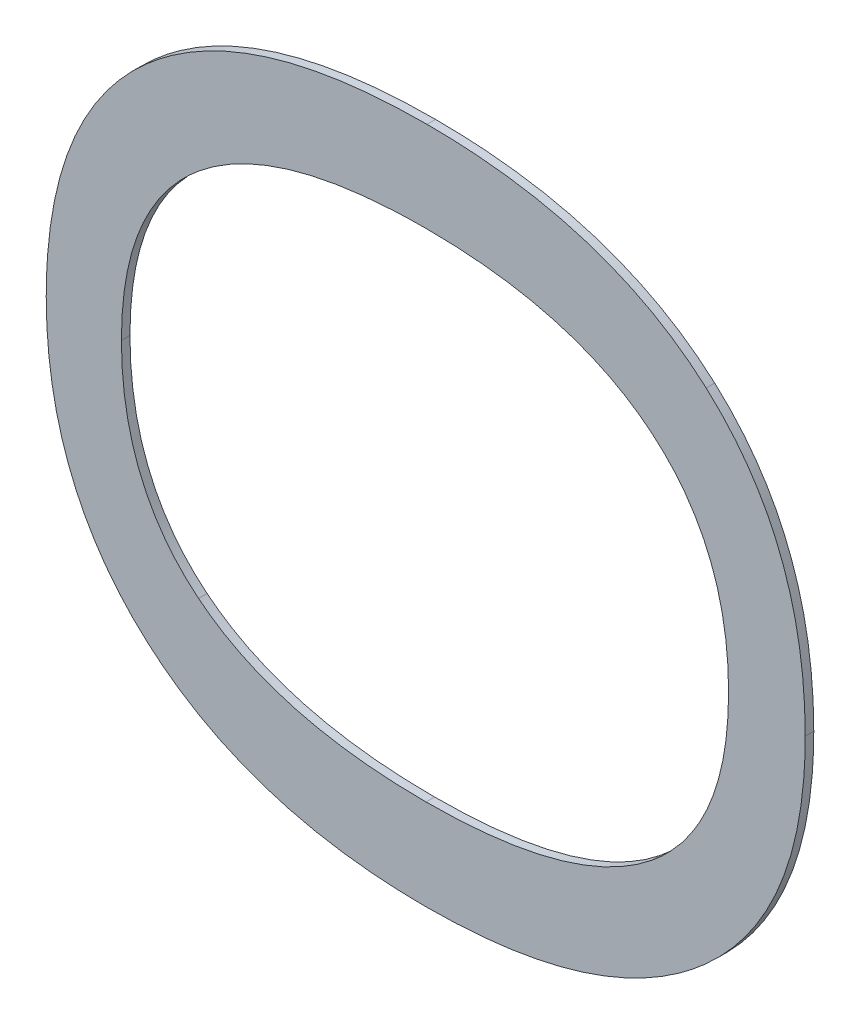
ISO-10303-21;
HEADER;
FILE_DESCRIPTION(('STEP AP214'),'2;1');
FILE_NAME('part.step','',(''),(''),'','','');
FILE_SCHEMA(('AUTOMOTIVE_DESIGN { 1 0 10303 214 1 1 1 1 }'));
ENDSEC;
DATA;
#1=APPLICATION_CONTEXT('core data for automotive mechanical design processes');
#2=APPLICATION_PROTOCOL_DEFINITION('international standard','automotive_design',2000,#1);
#3=PRODUCT_CONTEXT('',#1,'mechanical');
#4=PRODUCT('Part','Part','',(#3));
#5=PRODUCT_RELATED_PRODUCT_CATEGORY('part','',(#4));
#6=PRODUCT_DEFINITION_FORMATION('','',#4);
#7=PRODUCT_DEFINITION_CONTEXT('part definition',#1,'design');
#8=PRODUCT_DEFINITION('design','',#6,#7);
#9=PRODUCT_DEFINITION_SHAPE('','',#8);
#10=(LENGTH_UNIT() NAMED_UNIT(*) SI_UNIT(.MILLI.,.METRE.));
#11=(NAMED_UNIT(*) PLANE_ANGLE_UNIT() SI_UNIT($,.RADIAN.));
#12=(NAMED_UNIT(*) SI_UNIT($,.STERADIAN.) SOLID_ANGLE_UNIT());
#13=UNCERTAINTY_MEASURE_WITH_UNIT(LENGTH_MEASURE(1.E-05),#10,'distance_accuracy_value','');
#14=(GEOMETRIC_REPRESENTATION_CONTEXT(3) GLOBAL_UNCERTAINTY_ASSIGNED_CONTEXT((#13)) GLOBAL_UNIT_ASSIGNED_CONTEXT((#10,
#11,#12)) REPRESENTATION_CONTEXT('',''));
#15=CARTESIAN_POINT('',(0.,0.,0.));
#16=DIRECTION('',(0.,0.,1.));
#17=DIRECTION('',(1.,0.,0.));
#18=AXIS2_PLACEMENT_3D('',#15,#16,#17);
#19=CARTESIAN_POINT('',(32.574920494297,13.734089114766,2.64));
#20=DIRECTION('',(0.,0.,1.));
#21=DIRECTION('',(1.,0.,0.));
#22=AXIS2_PLACEMENT_3D('',#19,#20,#21);
#23=PLANE('',#22);
#24=CARTESIAN_POINT('',(32.471042254931,15.863117720616,2.64));
#25=CARTESIAN_POINT('',(32.471042254931,16.005350196577,2.64));
#26=CARTESIAN_POINT('',(32.561708375066,16.080055301813,2.64));
#27=B_SPLINE_CURVE_WITH_KNOTS('',2,(#24,#25,#26),.UNSPECIFIED.,.F.,.F.,(3,3),(0.,1.),.UNSPECIFIED.);
#28=CARTESIAN_POINT('',(32.561708375066,16.080055301813,2.64));
#29=VERTEX_POINT('',#28);
#30=CARTESIAN_POINT('',(32.471042254931,15.863117720616,2.64));
#31=VERTEX_POINT('',#30);
#32=EDGE_CURVE('E290',#29,#31,#27,.F.);
#33=ORIENTED_EDGE('',*,*,#32,.T.);
#34=CARTESIAN_POINT('',(32.561330599565,15.646557914919,2.64));
#35=CARTESIAN_POINT('',(32.471042254931,15.719751918153,2.64));
#36=CARTESIAN_POINT('',(32.471042254931,15.863117720616,2.64));
#37=B_SPLINE_CURVE_WITH_KNOTS('',2,(#34,#35,#36),.UNSPECIFIED.,.F.,.F.,(3,3),(0.,1.),.UNSPECIFIED.);
#38=CARTESIAN_POINT('',(32.561330599565,15.646557914919,2.64));
#39=VERTEX_POINT('',#38);
#40=EDGE_CURVE('E282',#31,#39,#37,.F.);
#41=ORIENTED_EDGE('',*,*,#40,.T.);
#42=CARTESIAN_POINT('',(32.827662327461,15.573363911686,2.64));
#43=CARTESIAN_POINT('',(32.651618944199,15.573363911686,2.64));
#44=CARTESIAN_POINT('',(32.561330599565,15.646557914919,2.64));
#45=B_SPLINE_CURVE_WITH_KNOTS('',2,(#42,#43,#44),.UNSPECIFIED.,.F.,.F.,(3,3),(0.,1.),.UNSPECIFIED.);
#46=CARTESIAN_POINT('',(32.827662327461,15.573363911686,2.64));
#47=VERTEX_POINT('',#46);
#48=EDGE_CURVE('E273',#39,#47,#45,.F.);
#49=ORIENTED_EDGE('',*,*,#48,.T.);
#50=CARTESIAN_POINT('',(33.091821846228,15.646274583294,2.64));
#51=CARTESIAN_POINT('',(33.001816833219,15.573363911686,2.64));
#52=CARTESIAN_POINT('',(32.827662327461,15.573363911686,2.64));
#53=B_SPLINE_CURVE_WITH_KNOTS('',2,(#50,#51,#52),.UNSPECIFIED.,.F.,.F.,(3,3),(0.,1.),.UNSPECIFIED.);
#54=CARTESIAN_POINT('',(33.091821846228,15.646274583294,2.64));
#55=VERTEX_POINT('',#54);
#56=EDGE_CURVE('E264',#47,#55,#53,.F.);
#57=ORIENTED_EDGE('',*,*,#56,.T.);
#58=CARTESIAN_POINT('',(33.181826859236,15.861984394114,2.64));
#59=CARTESIAN_POINT('',(33.181826859236,15.719185254902,2.64));
#60=CARTESIAN_POINT('',(33.091821846228,15.646274583294,2.64));
#61=B_SPLINE_CURVE_WITH_KNOTS('',2,(#58,#59,#60),.UNSPECIFIED.,.F.,.F.,(3,3),(0.,1.),.UNSPECIFIED.);
#62=CARTESIAN_POINT('',(33.181826859236,15.861984394114,2.64));
#63=VERTEX_POINT('',#62);
#64=EDGE_CURVE('E255',#55,#63,#61,.F.);
#65=ORIENTED_EDGE('',*,*,#64,.T.);
#66=CARTESIAN_POINT('',(33.091160739102,16.080055301813,2.64));
#67=CARTESIAN_POINT('',(33.181826859236,16.005350196577,2.64));
#68=CARTESIAN_POINT('',(33.181826859236,15.861984394114,2.64));
#69=B_SPLINE_CURVE_WITH_KNOTS('',2,(#66,#67,#68),.UNSPECIFIED.,.F.,.F.,(3,3),(0.,1.),.UNSPECIFIED.);
#70=CARTESIAN_POINT('',(33.091160739102,16.080055301813,2.64));
#71=VERTEX_POINT('',#70);
#72=EDGE_CURVE('E246',#63,#71,#69,.F.);
#73=ORIENTED_EDGE('',*,*,#72,.T.);
#74=CARTESIAN_POINT('',(32.827662327461,16.154760407049,2.64));
#75=CARTESIAN_POINT('',(33.000494618967,16.154760407049,2.64));
#76=CARTESIAN_POINT('',(33.091160739102,16.080055301813,2.64));
#77=B_SPLINE_CURVE_WITH_KNOTS('',2,(#74,#75,#76),.UNSPECIFIED.,.F.,.F.,(3,3),(0.,1.),.UNSPECIFIED.);
#78=CARTESIAN_POINT('',(32.827662327461,16.154760407049,2.64));
#79=VERTEX_POINT('',#78);
#80=EDGE_CURVE('E237',#71,#79,#77,.F.);
#81=ORIENTED_EDGE('',*,*,#80,.T.);
#82=CARTESIAN_POINT('',(32.561708375066,16.080055301813,2.64));
#83=CARTESIAN_POINT('',(32.6523744952,16.154760407049,2.64));
#84=CARTESIAN_POINT('',(32.827662327461,16.154760407049,2.64));
#85=B_SPLINE_CURVE_WITH_KNOTS('',2,(#82,#83,#84),.UNSPECIFIED.,.F.,.F.,(3,3),(0.,1.),.UNSPECIFIED.);
#86=EDGE_CURVE('E21',#79,#29,#85,.F.);
#87=ORIENTED_EDGE('',*,*,#86,.T.);
#88=EDGE_LOOP('',(#33,#41,#49,#57,#65,#73,#81,#87));
#89=FACE_BOUND('',#88,.T.);
#90=CARTESIAN_POINT('',(32.3830205633,15.863117720616,2.64));
#91=CARTESIAN_POINT('',(32.3830205633,15.676685511089,2.64));
#92=CARTESIAN_POINT('',(32.501736514352,15.571852809683,2.64));
#93=B_SPLINE_CURVE_WITH_KNOTS('',2,(#90,#91,#92),.UNSPECIFIED.,.F.,.F.,(3,3),(0.,1.),.UNSPECIFIED.);
#94=CARTESIAN_POINT('',(32.501736514352,15.571852809683,2.64));
#95=VERTEX_POINT('',#94);
#96=CARTESIAN_POINT('',(32.3830205633,15.863117720616,2.64));
#97=VERTEX_POINT('',#96);
#98=EDGE_CURVE('E222',#95,#97,#93,.F.);
#99=ORIENTED_EDGE('',*,*,#98,.T.);
#100=CARTESIAN_POINT('',(32.499658749099,16.157310391678,2.64));
#101=CARTESIAN_POINT('',(32.3830205633,16.053705460649,2.64));
#102=CARTESIAN_POINT('',(32.3830205633,15.863117720616,2.64));
#103=B_SPLINE_CURVE_WITH_KNOTS('',2,(#100,#101,#102),.UNSPECIFIED.,.F.,.F.,(3,3),(0.,1.),.UNSPECIFIED.);
#104=CARTESIAN_POINT('',(32.499658749099,16.157310391678,2.64));
#105=VERTEX_POINT('',#104);
#106=EDGE_CURVE('E213',#97,#105,#103,.F.);
#107=ORIENTED_EDGE('',*,*,#106,.T.);
#108=CARTESIAN_POINT('',(32.828795653962,16.260915322706,2.64));
#109=CARTESIAN_POINT('',(32.616296934897,16.260915322706,2.64));
#110=CARTESIAN_POINT('',(32.499658749099,16.157310391678,2.64));
#111=B_SPLINE_CURVE_WITH_KNOTS('',2,(#108,#109,#110),.UNSPECIFIED.,.F.,.F.,(3,3),(0.,1.),.UNSPECIFIED.);
#112=CARTESIAN_POINT('',(32.828795653962,16.260915322706,2.64));
#113=VERTEX_POINT('',#112);
#114=EDGE_CURVE('E204',#105,#113,#111,.F.);
#115=ORIENTED_EDGE('',*,*,#114,.T.);
#116=CARTESIAN_POINT('',(33.155571461947,16.157027060052,2.64));
#117=CARTESIAN_POINT('',(33.039594383275,16.260915322706,2.64));
#118=CARTESIAN_POINT('',(32.828795653962,16.260915322706,2.64));
#119=B_SPLINE_CURVE_WITH_KNOTS('',2,(#116,#117,#118),.UNSPECIFIED.,.F.,.F.,(3,3),(0.,1.),.UNSPECIFIED.);
#120=CARTESIAN_POINT('',(33.155571461947,16.157027060052,2.64));
#121=VERTEX_POINT('',#120);
#122=EDGE_CURVE('E192',#113,#121,#119,.F.);
#123=ORIENTED_EDGE('',*,*,#122,.T.);
#124=CARTESIAN_POINT('',(33.27154854062,15.861984394114,2.64));
#125=CARTESIAN_POINT('',(33.27154854062,16.053138797398,2.64));
#126=CARTESIAN_POINT('',(33.155571461947,16.157027060052,2.64));
#127=B_SPLINE_CURVE_WITH_KNOTS('',2,(#124,#125,#126),.UNSPECIFIED.,.F.,.F.,(3,3),(0.,1.),.UNSPECIFIED.);
#128=CARTESIAN_POINT('',(33.27154854062,15.861984394114,2.64));
#129=VERTEX_POINT('',#128);
#130=EDGE_CURVE('E188',#121,#129,#127,.F.);
#131=ORIENTED_EDGE('',*,*,#130,.T.);
#132=CARTESIAN_POINT('',(33.153493696694,15.571475034183,2.64));
#133=CARTESIAN_POINT('',(33.27154854062,15.675929960088,2.64));
#134=CARTESIAN_POINT('',(33.27154854062,15.861984394114,2.64));
#135=B_SPLINE_CURVE_WITH_KNOTS('',2,(#132,#133,#134),.UNSPECIFIED.,.F.,.F.,(3,3),(0.,1.),.UNSPECIFIED.);
#136=CARTESIAN_POINT('',(33.153493696694,15.571475034183,2.64));
#137=VERTEX_POINT('',#136);
#138=EDGE_CURVE('E135',#129,#137,#135,.F.);
#139=ORIENTED_EDGE('',*,*,#138,.T.);
#140=CARTESIAN_POINT('',(32.827662327461,15.467020108278,2.64));
#141=CARTESIAN_POINT('',(33.035438852769,15.467020108278,2.64));
#142=CARTESIAN_POINT('',(33.153493696694,15.571475034183,2.64));
#143=B_SPLINE_CURVE_WITH_KNOTS('',2,(#140,#141,#142),.UNSPECIFIED.,.F.,.F.,(3,3),(0.,1.),.UNSPECIFIED.);
#144=CARTESIAN_POINT('',(32.827662327461,15.467020108278,2.64));
#145=VERTEX_POINT('',#144);
#146=EDGE_CURVE('E130',#137,#145,#143,.F.);
#147=ORIENTED_EDGE('',*,*,#146,.T.);
#148=CARTESIAN_POINT('',(32.501736514352,15.571852809683,2.64));
#149=CARTESIAN_POINT('',(32.620452465403,15.467020108278,2.64));
#150=CARTESIAN_POINT('',(32.827662327461,15.467020108278,2.64));
#151=B_SPLINE_CURVE_WITH_KNOTS('',2,(#148,#149,#150),.UNSPECIFIED.,.F.,.F.,(3,3),(0.,1.),.UNSPECIFIED.);
#152=EDGE_CURVE('E132',#145,#95,#151,.F.);
#153=ORIENTED_EDGE('',*,*,#152,.T.);
#154=EDGE_LOOP('',(#99,#107,#115,#123,#131,#139,#147,#153));
#155=FACE_BOUND('',#154,.T.);
#156=ADVANCED_FACE('F17',(#89,#155),#23,.F.);
#157=CARTESIAN_POINT('',(32.827662327461,15.467020108278,2.64));
#158=CARTESIAN_POINT('',(32.620452465403,15.467020108278,2.64));
#159=CARTESIAN_POINT('',(32.501736514352,15.571852809683,2.64));
#160=(BOUNDED_CURVE() B_SPLINE_CURVE(2,(#157,#158,#159),.UNSPECIFIED.,.F.,
.F.) B_SPLINE_CURVE_WITH_KNOTS((3,3),(0.,1.),
.UNSPECIFIED.) CURVE() GEOMETRIC_REPRESENTATION_ITEM() RATIONAL_B_SPLINE_CURVE((1.,1.,1.)) REPRESENTATION_ITEM(''));
#161=DIRECTION('',(0.,0.,1.));
#162=VECTOR('',#161,1.);
#163=SURFACE_OF_LINEAR_EXTRUSION('',#160,#162);
#164=DIRECTION('',(0.,0.,1.));
#165=VECTOR('',#164,1.);
#166=CARTESIAN_POINT('',(32.501736514352,15.571852809683,2.64));
#167=LINE('',#166,#165);
#168=CARTESIAN_POINT('',(32.501736514352,15.571852809683,2.65));
#169=VERTEX_POINT('',#168);
#170=EDGE_CURVE('E145',#169,#95,#167,.F.);
#171=ORIENTED_EDGE('',*,*,#170,.T.);
#172=ORIENTED_EDGE('',*,*,#152,.F.);
#173=DIRECTION('',(0.,0.,1.));
#174=VECTOR('',#173,1.);
#175=CARTESIAN_POINT('',(32.827662327461,15.467020108278,2.64));
#176=LINE('',#175,#174);
#177=CARTESIAN_POINT('',(32.827662327461,15.467020108278,2.65));
#178=VERTEX_POINT('',#177);
#179=EDGE_CURVE('E139',#145,#178,#176,.T.);
#180=ORIENTED_EDGE('',*,*,#179,.T.);
#181=CARTESIAN_POINT('',(32.501736514352,15.571852809683,2.65));
#182=CARTESIAN_POINT('',(32.620452465403,15.467020108278,2.65));
#183=CARTESIAN_POINT('',(32.827662327461,15.467020108278,2.65));
#184=B_SPLINE_CURVE_WITH_KNOTS('',2,(#181,#182,#183),.UNSPECIFIED.,.F.,.F.,(3,3),(0.,1.),.UNSPECIFIED.);
#185=EDGE_CURVE('E305',#169,#178,#184,.T.);
#186=ORIENTED_EDGE('',*,*,#185,.F.);
#187=EDGE_LOOP('',(#171,#172,#180,#186));
#188=FACE_BOUND('',#187,.T.);
#189=ADVANCED_FACE('F142',(#188),#163,.F.);
#190=CARTESIAN_POINT('',(33.153493696694,15.571475034183,2.64));
#191=CARTESIAN_POINT('',(33.035438852769,15.467020108278,2.64));
#192=CARTESIAN_POINT('',(32.827662327461,15.467020108278,2.64));
#193=(BOUNDED_CURVE() B_SPLINE_CURVE(2,(#190,#191,#192),.UNSPECIFIED.,.F.,
.F.) B_SPLINE_CURVE_WITH_KNOTS((3,3),(0.,1.),
.UNSPECIFIED.) CURVE() GEOMETRIC_REPRESENTATION_ITEM() RATIONAL_B_SPLINE_CURVE((1.,1.,1.)) REPRESENTATION_ITEM(''));
#194=DIRECTION('',(0.,0.,1.));
#195=VECTOR('',#194,1.);
#196=SURFACE_OF_LINEAR_EXTRUSION('',#193,#195);
#197=ORIENTED_EDGE('',*,*,#179,.F.);
#198=ORIENTED_EDGE('',*,*,#146,.F.);
#199=DIRECTION('',(0.,0.,1.));
#200=VECTOR('',#199,1.);
#201=CARTESIAN_POINT('',(33.153493696694,15.571475034183,2.64));
#202=LINE('',#201,#200);
#203=CARTESIAN_POINT('',(33.153493696694,15.571475034183,2.65));
#204=VERTEX_POINT('',#203);
#205=EDGE_CURVE('E153',#137,#204,#202,.T.);
#206=ORIENTED_EDGE('',*,*,#205,.T.);
#207=CARTESIAN_POINT('',(32.827662327461,15.467020108278,2.65));
#208=CARTESIAN_POINT('',(33.035438852769,15.467020108278,2.65));
#209=CARTESIAN_POINT('',(33.153493696694,15.571475034183,2.65));
#210=B_SPLINE_CURVE_WITH_KNOTS('',2,(#207,#208,#209),.UNSPECIFIED.,.F.,.F.,(3,3),(0.,1.),.UNSPECIFIED.);
#211=EDGE_CURVE('E150',#178,#204,#210,.T.);
#212=ORIENTED_EDGE('',*,*,#211,.F.);
#213=EDGE_LOOP('',(#197,#198,#206,#212));
#214=FACE_BOUND('',#213,.T.);
#215=ADVANCED_FACE('F148',(#214),#196,.F.);
#216=CARTESIAN_POINT('',(33.27154854062,15.861984394114,2.64));
#217=CARTESIAN_POINT('',(33.27154854062,15.675929960088,2.64));
#218=CARTESIAN_POINT('',(33.153493696694,15.571475034183,2.64));
#219=(BOUNDED_CURVE() B_SPLINE_CURVE(2,(#216,#217,#218),.UNSPECIFIED.,.F.,
.F.) B_SPLINE_CURVE_WITH_KNOTS((3,3),(0.,1.),
.UNSPECIFIED.) CURVE() GEOMETRIC_REPRESENTATION_ITEM() RATIONAL_B_SPLINE_CURVE((1.,1.,1.)) REPRESENTATION_ITEM(''));
#220=DIRECTION('',(0.,0.,1.));
#221=VECTOR('',#220,1.);
#222=SURFACE_OF_LINEAR_EXTRUSION('',#219,#221);
#223=ORIENTED_EDGE('',*,*,#205,.F.);
#224=ORIENTED_EDGE('',*,*,#138,.F.);
#225=DIRECTION('',(0.,0.,1.));
#226=VECTOR('',#225,1.);
#227=CARTESIAN_POINT('',(33.27154854062,15.861984394114,2.64));
#228=LINE('',#227,#226);
#229=CARTESIAN_POINT('',(33.27154854062,15.861984394114,2.65));
#230=VERTEX_POINT('',#229);
#231=EDGE_CURVE('E184',#129,#230,#228,.T.);
#232=ORIENTED_EDGE('',*,*,#231,.T.);
#233=CARTESIAN_POINT('',(33.153493696694,15.571475034183,2.65));
#234=CARTESIAN_POINT('',(33.27154854062,15.675929960088,2.65));
#235=CARTESIAN_POINT('',(33.27154854062,15.861984394114,2.65));
#236=B_SPLINE_CURVE_WITH_KNOTS('',2,(#233,#234,#235),.UNSPECIFIED.,.F.,.F.,(3,3),(0.,1.),.UNSPECIFIED.);
#237=EDGE_CURVE('E464',#204,#230,#236,.T.);
#238=ORIENTED_EDGE('',*,*,#237,.F.);
#239=EDGE_LOOP('',(#223,#224,#232,#238));
#240=FACE_BOUND('',#239,.T.);
#241=ADVANCED_FACE('F172',(#240),#222,.F.);
#242=CARTESIAN_POINT('',(33.155571461947,16.157027060052,2.64));
#243=CARTESIAN_POINT('',(33.27154854062,16.053138797398,2.64));
#244=CARTESIAN_POINT('',(33.27154854062,15.861984394114,2.64));
#245=(BOUNDED_CURVE() B_SPLINE_CURVE(2,(#242,#243,#244),.UNSPECIFIED.,.F.,
.F.) B_SPLINE_CURVE_WITH_KNOTS((3,3),(0.,1.),
.UNSPECIFIED.) CURVE() GEOMETRIC_REPRESENTATION_ITEM() RATIONAL_B_SPLINE_CURVE((1.,1.,1.)) REPRESENTATION_ITEM(''));
#246=DIRECTION('',(0.,0.,1.));
#247=VECTOR('',#246,1.);
#248=SURFACE_OF_LINEAR_EXTRUSION('',#245,#247);
#249=ORIENTED_EDGE('',*,*,#231,.F.);
#250=ORIENTED_EDGE('',*,*,#130,.F.);
#251=DIRECTION('',(0.,0.,1.));
#252=VECTOR('',#251,1.);
#253=CARTESIAN_POINT('',(33.155571461947,16.157027060052,2.64));
#254=LINE('',#253,#252);
#255=CARTESIAN_POINT('',(33.155571461947,16.157027060052,2.65));
#256=VERTEX_POINT('',#255);
#257=EDGE_CURVE('E203',#121,#256,#254,.T.);
#258=ORIENTED_EDGE('',*,*,#257,.T.);
#259=CARTESIAN_POINT('',(33.27154854062,15.861984394114,2.65));
#260=CARTESIAN_POINT('',(33.27154854062,16.053138797398,2.65));
#261=CARTESIAN_POINT('',(33.155571461947,16.157027060052,2.65));
#262=B_SPLINE_CURVE_WITH_KNOTS('',2,(#259,#260,#261),.UNSPECIFIED.,.F.,.F.,(3,3),(0.,1.),.UNSPECIFIED.);
#263=EDGE_CURVE('E468',#230,#256,#262,.T.);
#264=ORIENTED_EDGE('',*,*,#263,.F.);
#265=EDGE_LOOP('',(#249,#250,#258,#264));
#266=FACE_BOUND('',#265,.T.);
#267=ADVANCED_FACE('F176',(#266),#248,.F.);
#268=CARTESIAN_POINT('',(32.828795653962,16.260915322706,2.64));
#269=CARTESIAN_POINT('',(33.039594383275,16.260915322706,2.64));
#270=CARTESIAN_POINT('',(33.155571461947,16.157027060052,2.64));
#271=(BOUNDED_CURVE() B_SPLINE_CURVE(2,(#268,#269,#270),.UNSPECIFIED.,.F.,
.F.) B_SPLINE_CURVE_WITH_KNOTS((3,3),(0.,1.),
.UNSPECIFIED.) CURVE() GEOMETRIC_REPRESENTATION_ITEM() RATIONAL_B_SPLINE_CURVE((1.,1.,1.)) REPRESENTATION_ITEM(''));
#272=DIRECTION('',(0.,0.,1.));
#273=VECTOR('',#272,1.);
#274=SURFACE_OF_LINEAR_EXTRUSION('',#271,#273);
#275=ORIENTED_EDGE('',*,*,#257,.F.);
#276=ORIENTED_EDGE('',*,*,#122,.F.);
#277=DIRECTION('',(0.,0.,1.));
#278=VECTOR('',#277,1.);
#279=CARTESIAN_POINT('',(32.828795653962,16.260915322706,2.64));
#280=LINE('',#279,#278);
#281=CARTESIAN_POINT('',(32.828795653962,16.260915322706,2.65));
#282=VERTEX_POINT('',#281);
#283=EDGE_CURVE('E212',#113,#282,#280,.T.);
#284=ORIENTED_EDGE('',*,*,#283,.T.);
#285=CARTESIAN_POINT('',(33.155571461947,16.157027060052,2.65));
#286=CARTESIAN_POINT('',(33.039594383275,16.260915322706,2.65));
#287=CARTESIAN_POINT('',(32.828795653962,16.260915322706,2.65));
#288=B_SPLINE_CURVE_WITH_KNOTS('',2,(#285,#286,#287),.UNSPECIFIED.,.F.,.F.,(3,3),(0.,1.),.UNSPECIFIED.);
#289=EDGE_CURVE('E472',#256,#282,#288,.T.);
#290=ORIENTED_EDGE('',*,*,#289,.F.);
#291=EDGE_LOOP('',(#275,#276,#284,#290));
#292=FACE_BOUND('',#291,.T.);
#293=ADVANCED_FACE('F433',(#292),#274,.F.);
#294=CARTESIAN_POINT('',(32.499658749099,16.157310391678,2.64));
#295=CARTESIAN_POINT('',(32.616296934897,16.260915322706,2.64));
#296=CARTESIAN_POINT('',(32.828795653962,16.260915322706,2.64));
#297=(BOUNDED_CURVE() B_SPLINE_CURVE(2,(#294,#295,#296),.UNSPECIFIED.,.F.,
.F.) B_SPLINE_CURVE_WITH_KNOTS((3,3),(0.,1.),
.UNSPECIFIED.) CURVE() GEOMETRIC_REPRESENTATION_ITEM() RATIONAL_B_SPLINE_CURVE((1.,1.,1.)) REPRESENTATION_ITEM(''));
#298=DIRECTION('',(0.,0.,1.));
#299=VECTOR('',#298,1.);
#300=SURFACE_OF_LINEAR_EXTRUSION('',#297,#299);
#301=ORIENTED_EDGE('',*,*,#283,.F.);
#302=ORIENTED_EDGE('',*,*,#114,.F.);
#303=DIRECTION('',(0.,0.,1.));
#304=VECTOR('',#303,1.);
#305=CARTESIAN_POINT('',(32.499658749099,16.157310391678,2.64));
#306=LINE('',#305,#304);
#307=CARTESIAN_POINT('',(32.499658749099,16.157310391678,2.65));
#308=VERTEX_POINT('',#307);
#309=EDGE_CURVE('E221',#105,#308,#306,.T.);
#310=ORIENTED_EDGE('',*,*,#309,.T.);
#311=CARTESIAN_POINT('',(32.828795653962,16.260915322706,2.65));
#312=CARTESIAN_POINT('',(32.616296934897,16.260915322706,2.65));
#313=CARTESIAN_POINT('',(32.499658749099,16.157310391678,2.65));
#314=B_SPLINE_CURVE_WITH_KNOTS('',2,(#311,#312,#313),.UNSPECIFIED.,.F.,.F.,(3,3),(0.,1.),.UNSPECIFIED.);
#315=EDGE_CURVE('E476',#282,#308,#314,.T.);
#316=ORIENTED_EDGE('',*,*,#315,.F.);
#317=EDGE_LOOP('',(#301,#302,#310,#316));
#318=FACE_BOUND('',#317,.T.);
#319=ADVANCED_FACE('F407',(#318),#300,.F.);
#320=CARTESIAN_POINT('',(32.3830205633,15.863117720616,2.64));
#321=CARTESIAN_POINT('',(32.3830205633,16.053705460649,2.64));
#322=CARTESIAN_POINT('',(32.499658749099,16.157310391678,2.64));
#323=(BOUNDED_CURVE() B_SPLINE_CURVE(2,(#320,#321,#322),.UNSPECIFIED.,.F.,
.F.) B_SPLINE_CURVE_WITH_KNOTS((3,3),(0.,1.),
.UNSPECIFIED.) CURVE() GEOMETRIC_REPRESENTATION_ITEM() RATIONAL_B_SPLINE_CURVE((1.,1.,1.)) REPRESENTATION_ITEM(''));
#324=DIRECTION('',(0.,0.,1.));
#325=VECTOR('',#324,1.);
#326=SURFACE_OF_LINEAR_EXTRUSION('',#323,#325);
#327=ORIENTED_EDGE('',*,*,#309,.F.);
#328=ORIENTED_EDGE('',*,*,#106,.F.);
#329=DIRECTION('',(0.,0.,1.));
#330=VECTOR('',#329,1.);
#331=CARTESIAN_POINT('',(32.3830205633,15.863117720616,2.64));
#332=LINE('',#331,#330);
#333=CARTESIAN_POINT('',(32.3830205633,15.863117720616,2.65));
#334=VERTEX_POINT('',#333);
#335=EDGE_CURVE('E229',#97,#334,#332,.T.);
#336=ORIENTED_EDGE('',*,*,#335,.T.);
#337=CARTESIAN_POINT('',(32.499658749099,16.157310391678,2.65));
#338=CARTESIAN_POINT('',(32.3830205633,16.053705460649,2.65));
#339=CARTESIAN_POINT('',(32.3830205633,15.863117720616,2.65));
#340=B_SPLINE_CURVE_WITH_KNOTS('',2,(#337,#338,#339),.UNSPECIFIED.,.F.,.F.,(3,3),(0.,1.),.UNSPECIFIED.);
#341=EDGE_CURVE('E480',#308,#334,#340,.T.);
#342=ORIENTED_EDGE('',*,*,#341,.F.);
#343=EDGE_LOOP('',(#327,#328,#336,#342));
#344=FACE_BOUND('',#343,.T.);
#345=ADVANCED_FACE('F402',(#344),#326,.F.);
#346=CARTESIAN_POINT('',(32.501736514352,15.571852809683,2.64));
#347=CARTESIAN_POINT('',(32.3830205633,15.676685511089,2.64));
#348=CARTESIAN_POINT('',(32.3830205633,15.863117720616,2.64));
#349=(BOUNDED_CURVE() B_SPLINE_CURVE(2,(#346,#347,#348),.UNSPECIFIED.,.F.,
.F.) B_SPLINE_CURVE_WITH_KNOTS((3,3),(0.,1.),
.UNSPECIFIED.) CURVE() GEOMETRIC_REPRESENTATION_ITEM() RATIONAL_B_SPLINE_CURVE((1.,1.,1.)) REPRESENTATION_ITEM(''));
#350=DIRECTION('',(0.,0.,1.));
#351=VECTOR('',#350,1.);
#352=SURFACE_OF_LINEAR_EXTRUSION('',#349,#351);
#353=ORIENTED_EDGE('',*,*,#335,.F.);
#354=ORIENTED_EDGE('',*,*,#98,.F.);
#355=ORIENTED_EDGE('',*,*,#170,.F.);
#356=CARTESIAN_POINT('',(32.3830205633,15.863117720616,2.65));
#357=CARTESIAN_POINT('',(32.3830205633,15.676685511089,2.65));
#358=CARTESIAN_POINT('',(32.501736514352,15.571852809683,2.65));
#359=B_SPLINE_CURVE_WITH_KNOTS('',2,(#356,#357,#358),.UNSPECIFIED.,.F.,.F.,(3,3),(0.,1.),.UNSPECIFIED.);
#360=EDGE_CURVE('E484',#334,#169,#359,.T.);
#361=ORIENTED_EDGE('',*,*,#360,.F.);
#362=EDGE_LOOP('',(#353,#354,#355,#361));
#363=FACE_BOUND('',#362,.T.);
#364=ADVANCED_FACE('F399',(#363),#352,.F.);
#365=CARTESIAN_POINT('',(32.827662327461,16.154760407049,2.64));
#366=CARTESIAN_POINT('',(32.6523744952,16.154760407049,2.64));
#367=CARTESIAN_POINT('',(32.561708375066,16.080055301813,2.64));
#368=(BOUNDED_CURVE() B_SPLINE_CURVE(2,(#365,#366,#367),.UNSPECIFIED.,.F.,
.F.) B_SPLINE_CURVE_WITH_KNOTS((3,3),(0.,1.),
.UNSPECIFIED.) CURVE() GEOMETRIC_REPRESENTATION_ITEM() RATIONAL_B_SPLINE_CURVE((1.,1.,1.)) REPRESENTATION_ITEM(''));
#369=DIRECTION('',(0.,0.,1.));
#370=VECTOR('',#369,1.);
#371=SURFACE_OF_LINEAR_EXTRUSION('',#368,#370);
#372=DIRECTION('',(0.,0.,1.));
#373=VECTOR('',#372,1.);
#374=CARTESIAN_POINT('',(32.561708375066,16.080055301813,2.64));
#375=LINE('',#374,#373);
#376=CARTESIAN_POINT('',(32.561708375066,16.080055301813,2.65));
#377=VERTEX_POINT('',#376);
#378=EDGE_CURVE('E297',#377,#29,#375,.F.);
#379=ORIENTED_EDGE('',*,*,#378,.T.);
#380=ORIENTED_EDGE('',*,*,#86,.F.);
#381=DIRECTION('',(0.,0.,1.));
#382=VECTOR('',#381,1.);
#383=CARTESIAN_POINT('',(32.827662327461,16.154760407049,2.64));
#384=LINE('',#383,#382);
#385=CARTESIAN_POINT('',(32.827662327461,16.154760407049,2.65));
#386=VERTEX_POINT('',#385);
#387=EDGE_CURVE('E245',#79,#386,#384,.T.);
#388=ORIENTED_EDGE('',*,*,#387,.T.);
#389=CARTESIAN_POINT('',(32.561708375066,16.080055301813,2.65));
#390=CARTESIAN_POINT('',(32.6523744952,16.154760407049,2.65));
#391=CARTESIAN_POINT('',(32.827662327461,16.154760407049,2.65));
#392=B_SPLINE_CURVE_WITH_KNOTS('',2,(#389,#390,#391),.UNSPECIFIED.,.F.,.F.,(3,3),(0.,1.),.UNSPECIFIED.);
#393=EDGE_CURVE('E488',#377,#386,#392,.T.);
#394=ORIENTED_EDGE('',*,*,#393,.F.);
#395=EDGE_LOOP('',(#379,#380,#388,#394));
#396=FACE_BOUND('',#395,.T.);
#397=ADVANCED_FACE('F396',(#396),#371,.F.);
#398=CARTESIAN_POINT('',(33.091160739102,16.080055301813,2.64));
#399=CARTESIAN_POINT('',(33.000494618967,16.154760407049,2.64));
#400=CARTESIAN_POINT('',(32.827662327461,16.154760407049,2.64));
#401=(BOUNDED_CURVE() B_SPLINE_CURVE(2,(#398,#399,#400),.UNSPECIFIED.,.F.,
.F.) B_SPLINE_CURVE_WITH_KNOTS((3,3),(0.,1.),
.UNSPECIFIED.) CURVE() GEOMETRIC_REPRESENTATION_ITEM() RATIONAL_B_SPLINE_CURVE((1.,1.,1.)) REPRESENTATION_ITEM(''));
#402=DIRECTION('',(0.,0.,1.));
#403=VECTOR('',#402,1.);
#404=SURFACE_OF_LINEAR_EXTRUSION('',#401,#403);
#405=ORIENTED_EDGE('',*,*,#387,.F.);
#406=ORIENTED_EDGE('',*,*,#80,.F.);
#407=DIRECTION('',(0.,0.,1.));
#408=VECTOR('',#407,1.);
#409=CARTESIAN_POINT('',(33.091160739102,16.080055301813,2.64));
#410=LINE('',#409,#408);
#411=CARTESIAN_POINT('',(33.091160739102,16.080055301813,2.65));
#412=VERTEX_POINT('',#411);
#413=EDGE_CURVE('E254',#71,#412,#410,.T.);
#414=ORIENTED_EDGE('',*,*,#413,.T.);
#415=CARTESIAN_POINT('',(32.827662327461,16.154760407049,2.65));
#416=CARTESIAN_POINT('',(33.000494618967,16.154760407049,2.65));
#417=CARTESIAN_POINT('',(33.091160739102,16.080055301813,2.65));
#418=B_SPLINE_CURVE_WITH_KNOTS('',2,(#415,#416,#417),.UNSPECIFIED.,.F.,.F.,(3,3),(0.,1.),.UNSPECIFIED.);
#419=EDGE_CURVE('E492',#386,#412,#418,.T.);
#420=ORIENTED_EDGE('',*,*,#419,.F.);
#421=EDGE_LOOP('',(#405,#406,#414,#420));
#422=FACE_BOUND('',#421,.T.);
#423=ADVANCED_FACE('F366',(#422),#404,.F.);
#424=CARTESIAN_POINT('',(33.181826859236,15.861984394114,2.64));
#425=CARTESIAN_POINT('',(33.181826859236,16.005350196577,2.64));
#426=CARTESIAN_POINT('',(33.091160739102,16.080055301813,2.64));
#427=(BOUNDED_CURVE() B_SPLINE_CURVE(2,(#424,#425,#426),.UNSPECIFIED.,.F.,
.F.) B_SPLINE_CURVE_WITH_KNOTS((3,3),(0.,1.),
.UNSPECIFIED.) CURVE() GEOMETRIC_REPRESENTATION_ITEM() RATIONAL_B_SPLINE_CURVE((1.,1.,1.)) REPRESENTATION_ITEM(''));
#428=DIRECTION('',(0.,0.,1.));
#429=VECTOR('',#428,1.);
#430=SURFACE_OF_LINEAR_EXTRUSION('',#427,#429);
#431=ORIENTED_EDGE('',*,*,#413,.F.);
#432=ORIENTED_EDGE('',*,*,#72,.F.);
#433=DIRECTION('',(0.,0.,1.));
#434=VECTOR('',#433,1.);
#435=CARTESIAN_POINT('',(33.181826859236,15.861984394114,2.64));
#436=LINE('',#435,#434);
#437=CARTESIAN_POINT('',(33.181826859236,15.861984394114,2.65));
#438=VERTEX_POINT('',#437);
#439=EDGE_CURVE('E263',#63,#438,#436,.T.);
#440=ORIENTED_EDGE('',*,*,#439,.T.);
#441=CARTESIAN_POINT('',(33.091160739102,16.080055301813,2.65));
#442=CARTESIAN_POINT('',(33.181826859236,16.005350196577,2.65));
#443=CARTESIAN_POINT('',(33.181826859236,15.861984394114,2.65));
#444=B_SPLINE_CURVE_WITH_KNOTS('',2,(#441,#442,#443),.UNSPECIFIED.,.F.,.F.,(3,3),(0.,1.),.UNSPECIFIED.);
#445=EDGE_CURVE('E496',#412,#438,#444,.T.);
#446=ORIENTED_EDGE('',*,*,#445,.F.);
#447=EDGE_LOOP('',(#431,#432,#440,#446));
#448=FACE_BOUND('',#447,.T.);
#449=ADVANCED_FACE('F362',(#448),#430,.F.);
#450=CARTESIAN_POINT('',(33.091821846228,15.646274583294,2.64));
#451=CARTESIAN_POINT('',(33.181826859236,15.719185254902,2.64));
#452=CARTESIAN_POINT('',(33.181826859236,15.861984394114,2.64));
#453=(BOUNDED_CURVE() B_SPLINE_CURVE(2,(#450,#451,#452),.UNSPECIFIED.,.F.,
.F.) B_SPLINE_CURVE_WITH_KNOTS((3,3),(0.,1.),
.UNSPECIFIED.) CURVE() GEOMETRIC_REPRESENTATION_ITEM() RATIONAL_B_SPLINE_CURVE((1.,1.,1.)) REPRESENTATION_ITEM(''));
#454=DIRECTION('',(0.,0.,1.));
#455=VECTOR('',#454,1.);
#456=SURFACE_OF_LINEAR_EXTRUSION('',#453,#455);
#457=ORIENTED_EDGE('',*,*,#439,.F.);
#458=ORIENTED_EDGE('',*,*,#64,.F.);
#459=DIRECTION('',(0.,0.,1.));
#460=VECTOR('',#459,1.);
#461=CARTESIAN_POINT('',(33.091821846228,15.646274583294,2.64));
#462=LINE('',#461,#460);
#463=CARTESIAN_POINT('',(33.091821846228,15.646274583294,2.65));
#464=VERTEX_POINT('',#463);
#465=EDGE_CURVE('E272',#55,#464,#462,.T.);
#466=ORIENTED_EDGE('',*,*,#465,.T.);
#467=CARTESIAN_POINT('',(33.181826859236,15.861984394114,2.65));
#468=CARTESIAN_POINT('',(33.181826859236,15.719185254902,2.65));
#469=CARTESIAN_POINT('',(33.091821846228,15.646274583294,2.65));
#470=B_SPLINE_CURVE_WITH_KNOTS('',2,(#467,#468,#469),.UNSPECIFIED.,.F.,.F.,(3,3),(0.,1.),.UNSPECIFIED.);
#471=EDGE_CURVE('E500',#438,#464,#470,.T.);
#472=ORIENTED_EDGE('',*,*,#471,.F.);
#473=EDGE_LOOP('',(#457,#458,#466,#472));
#474=FACE_BOUND('',#473,.T.);
#475=ADVANCED_FACE('F359',(#474),#456,.F.);
#476=CARTESIAN_POINT('',(32.827662327461,15.573363911686,2.64));
#477=CARTESIAN_POINT('',(33.001816833219,15.573363911686,2.64));
#478=CARTESIAN_POINT('',(33.091821846228,15.646274583294,2.64));
#479=(BOUNDED_CURVE() B_SPLINE_CURVE(2,(#476,#477,#478),.UNSPECIFIED.,.F.,
.F.) B_SPLINE_CURVE_WITH_KNOTS((3,3),(0.,1.),
.UNSPECIFIED.) CURVE() GEOMETRIC_REPRESENTATION_ITEM() RATIONAL_B_SPLINE_CURVE((1.,1.,1.)) REPRESENTATION_ITEM(''));
#480=DIRECTION('',(0.,0.,1.));
#481=VECTOR('',#480,1.);
#482=SURFACE_OF_LINEAR_EXTRUSION('',#479,#481);
#483=ORIENTED_EDGE('',*,*,#465,.F.);
#484=ORIENTED_EDGE('',*,*,#56,.F.);
#485=DIRECTION('',(0.,0.,1.));
#486=VECTOR('',#485,1.);
#487=CARTESIAN_POINT('',(32.827662327461,15.573363911686,2.64));
#488=LINE('',#487,#486);
#489=CARTESIAN_POINT('',(32.827662327461,15.573363911686,2.65));
#490=VERTEX_POINT('',#489);
#491=EDGE_CURVE('E281',#47,#490,#488,.T.);
#492=ORIENTED_EDGE('',*,*,#491,.T.);
#493=CARTESIAN_POINT('',(33.091821846228,15.646274583294,2.65));
#494=CARTESIAN_POINT('',(33.001816833219,15.573363911686,2.65));
#495=CARTESIAN_POINT('',(32.827662327461,15.573363911686,2.65));
#496=B_SPLINE_CURVE_WITH_KNOTS('',2,(#493,#494,#495),.UNSPECIFIED.,.F.,.F.,(3,3),(0.,1.),.UNSPECIFIED.);
#497=EDGE_CURVE('E504',#464,#490,#496,.T.);
#498=ORIENTED_EDGE('',*,*,#497,.F.);
#499=EDGE_LOOP('',(#483,#484,#492,#498));
#500=FACE_BOUND('',#499,.T.);
#501=ADVANCED_FACE('F332',(#500),#482,.F.);
#502=CARTESIAN_POINT('',(32.561330599565,15.646557914919,2.64));
#503=CARTESIAN_POINT('',(32.651618944199,15.573363911686,2.64));
#504=CARTESIAN_POINT('',(32.827662327461,15.573363911686,2.64));
#505=(BOUNDED_CURVE() B_SPLINE_CURVE(2,(#502,#503,#504),.UNSPECIFIED.,.F.,
.F.) B_SPLINE_CURVE_WITH_KNOTS((3,3),(0.,1.),
.UNSPECIFIED.) CURVE() GEOMETRIC_REPRESENTATION_ITEM() RATIONAL_B_SPLINE_CURVE((1.,1.,1.)) REPRESENTATION_ITEM(''));
#506=DIRECTION('',(0.,0.,1.));
#507=VECTOR('',#506,1.);
#508=SURFACE_OF_LINEAR_EXTRUSION('',#505,#507);
#509=ORIENTED_EDGE('',*,*,#491,.F.);
#510=ORIENTED_EDGE('',*,*,#48,.F.);
#511=DIRECTION('',(0.,0.,1.));
#512=VECTOR('',#511,1.);
#513=CARTESIAN_POINT('',(32.561330599565,15.646557914919,2.64));
#514=LINE('',#513,#512);
#515=CARTESIAN_POINT('',(32.561330599565,15.646557914919,2.65));
#516=VERTEX_POINT('',#515);
#517=EDGE_CURVE('E289',#39,#516,#514,.T.);
#518=ORIENTED_EDGE('',*,*,#517,.T.);
#519=CARTESIAN_POINT('',(32.827662327461,15.573363911686,2.65));
#520=CARTESIAN_POINT('',(32.651618944199,15.573363911686,2.65));
#521=CARTESIAN_POINT('',(32.561330599565,15.646557914919,2.65));
#522=B_SPLINE_CURVE_WITH_KNOTS('',2,(#519,#520,#521),.UNSPECIFIED.,.F.,.F.,(3,3),(0.,1.),.UNSPECIFIED.);
#523=EDGE_CURVE('E507',#490,#516,#522,.T.);
#524=ORIENTED_EDGE('',*,*,#523,.F.);
#525=EDGE_LOOP('',(#509,#510,#518,#524));
#526=FACE_BOUND('',#525,.T.);
#527=ADVANCED_FACE('F328',(#526),#508,.F.);
#528=CARTESIAN_POINT('',(32.471042254931,15.863117720616,2.64));
#529=CARTESIAN_POINT('',(32.471042254931,15.719751918153,2.64));
#530=CARTESIAN_POINT('',(32.561330599565,15.646557914919,2.64));
#531=(BOUNDED_CURVE() B_SPLINE_CURVE(2,(#528,#529,#530),.UNSPECIFIED.,.F.,
.F.) B_SPLINE_CURVE_WITH_KNOTS((3,3),(0.,1.),
.UNSPECIFIED.) CURVE() GEOMETRIC_REPRESENTATION_ITEM() RATIONAL_B_SPLINE_CURVE((1.,1.,1.)) REPRESENTATION_ITEM(''));
#532=DIRECTION('',(0.,0.,1.));
#533=VECTOR('',#532,1.);
#534=SURFACE_OF_LINEAR_EXTRUSION('',#531,#533);
#535=ORIENTED_EDGE('',*,*,#517,.F.);
#536=ORIENTED_EDGE('',*,*,#40,.F.);
#537=DIRECTION('',(0.,0.,1.));
#538=VECTOR('',#537,1.);
#539=CARTESIAN_POINT('',(32.471042254931,15.863117720616,2.64));
#540=LINE('',#539,#538);
#541=CARTESIAN_POINT('',(32.471042254931,15.863117720616,2.65));
#542=VERTEX_POINT('',#541);
#543=EDGE_CURVE('E37',#31,#542,#540,.T.);
#544=ORIENTED_EDGE('',*,*,#543,.T.);
#545=CARTESIAN_POINT('',(32.561330599565,15.646557914919,2.65));
#546=CARTESIAN_POINT('',(32.471042254931,15.719751918153,2.65));
#547=CARTESIAN_POINT('',(32.471042254931,15.863117720616,2.65));
#548=B_SPLINE_CURVE_WITH_KNOTS('',2,(#545,#546,#547),.UNSPECIFIED.,.F.,.F.,(3,3),(0.,1.),.UNSPECIFIED.);
#549=EDGE_CURVE('E28',#516,#542,#548,.T.);
#550=ORIENTED_EDGE('',*,*,#549,.F.);
#551=EDGE_LOOP('',(#535,#536,#544,#550));
#552=FACE_BOUND('',#551,.T.);
#553=ADVANCED_FACE('F323',(#552),#534,.F.);
#554=CARTESIAN_POINT('',(32.561708375066,16.080055301813,2.64));
#555=CARTESIAN_POINT('',(32.471042254931,16.005350196577,2.64));
#556=CARTESIAN_POINT('',(32.471042254931,15.863117720616,2.64));
#557=(BOUNDED_CURVE() B_SPLINE_CURVE(2,(#554,#555,#556),.UNSPECIFIED.,.F.,
.F.) B_SPLINE_CURVE_WITH_KNOTS((3,3),(0.,1.),
.UNSPECIFIED.) CURVE() GEOMETRIC_REPRESENTATION_ITEM() RATIONAL_B_SPLINE_CURVE((1.,1.,1.)) REPRESENTATION_ITEM(''));
#558=DIRECTION('',(0.,0.,1.));
#559=VECTOR('',#558,1.);
#560=SURFACE_OF_LINEAR_EXTRUSION('',#557,#559);
#561=ORIENTED_EDGE('',*,*,#543,.F.);
#562=ORIENTED_EDGE('',*,*,#32,.F.);
#563=ORIENTED_EDGE('',*,*,#378,.F.);
#564=CARTESIAN_POINT('',(32.471042254931,15.863117720616,2.65));
#565=CARTESIAN_POINT('',(32.471042254931,16.005350196577,2.65));
#566=CARTESIAN_POINT('',(32.561708375066,16.080055301813,2.65));
#567=B_SPLINE_CURVE_WITH_KNOTS('',2,(#564,#565,#566),.UNSPECIFIED.,.F.,.F.,(3,3),(0.,1.),.UNSPECIFIED.);
#568=EDGE_CURVE('E11',#542,#377,#567,.T.);
#569=ORIENTED_EDGE('',*,*,#568,.F.);
#570=EDGE_LOOP('',(#561,#562,#563,#569));
#571=FACE_BOUND('',#570,.T.);
#572=ADVANCED_FACE('F327',(#571),#560,.F.);
#573=CARTESIAN_POINT('',(32.574920494297,13.734089114766,2.65));
#574=DIRECTION('',(0.,0.,1.));
#575=DIRECTION('',(1.,0.,0.));
#576=AXIS2_PLACEMENT_3D('',#573,#574,#575);
#577=PLANE('',#576);
#578=ORIENTED_EDGE('',*,*,#549,.T.);
#579=ORIENTED_EDGE('',*,*,#568,.T.);
#580=ORIENTED_EDGE('',*,*,#393,.T.);
#581=ORIENTED_EDGE('',*,*,#419,.T.);
#582=ORIENTED_EDGE('',*,*,#445,.T.);
#583=ORIENTED_EDGE('',*,*,#471,.T.);
#584=ORIENTED_EDGE('',*,*,#497,.T.);
#585=ORIENTED_EDGE('',*,*,#523,.T.);
#586=EDGE_LOOP('',(#578,#579,#580,#581,#582,#583,#584,#585));
#587=FACE_BOUND('',#586,.T.);
#588=ORIENTED_EDGE('',*,*,#341,.T.);
#589=ORIENTED_EDGE('',*,*,#360,.T.);
#590=ORIENTED_EDGE('',*,*,#185,.T.);
#591=ORIENTED_EDGE('',*,*,#211,.T.);
#592=ORIENTED_EDGE('',*,*,#237,.T.);
#593=ORIENTED_EDGE('',*,*,#263,.T.);
#594=ORIENTED_EDGE('',*,*,#289,.T.);
#595=ORIENTED_EDGE('',*,*,#315,.T.);
#596=EDGE_LOOP('',(#588,#589,#590,#591,#592,#593,#594,#595));
#597=FACE_BOUND('',#596,.T.);
#598=ADVANCED_FACE('F444',(#587,#597),#577,.T.);
#599=CLOSED_SHELL('',(#156,#189,#215,#241,#267,#293,#319,#345,#364,#397,#423,#449,#475,#501,
#527,#553,#572,#598));
#600=MANIFOLD_SOLID_BREP('B1',#599);
#601=ADVANCED_BREP_SHAPE_REPRESENTATION('',(#18,#600),#14);
#602=SHAPE_DEFINITION_REPRESENTATION(#9,#601);
ENDSEC;
END-ISO-10303-21;
